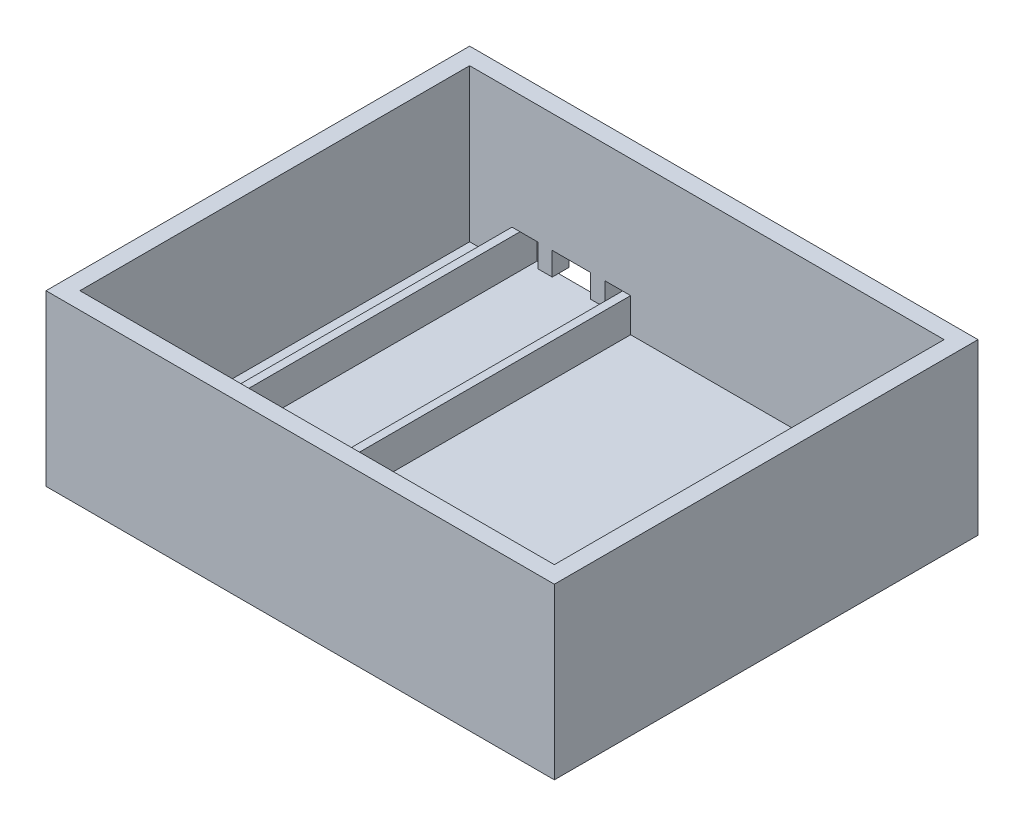
ISO-10303-21;
HEADER;
FILE_DESCRIPTION(('STEP AP214'),'2;1');
FILE_NAME('part.step','',(''),(''),'','','');
FILE_SCHEMA(('AUTOMOTIVE_DESIGN { 1 0 10303 214 1 1 1 1 }'));
ENDSEC;
DATA;
#1=APPLICATION_CONTEXT('core data for automotive mechanical design processes');
#2=APPLICATION_PROTOCOL_DEFINITION('international standard','automotive_design',2000,#1);
#3=PRODUCT_CONTEXT('',#1,'mechanical');
#4=PRODUCT('Part','Part','',(#3));
#5=PRODUCT_RELATED_PRODUCT_CATEGORY('part','',(#4));
#6=PRODUCT_DEFINITION_FORMATION('','',#4);
#7=PRODUCT_DEFINITION_CONTEXT('part definition',#1,'design');
#8=PRODUCT_DEFINITION('design','',#6,#7);
#9=PRODUCT_DEFINITION_SHAPE('','',#8);
#10=(LENGTH_UNIT() NAMED_UNIT(*) SI_UNIT(.MILLI.,.METRE.));
#11=(NAMED_UNIT(*) PLANE_ANGLE_UNIT() SI_UNIT($,.RADIAN.));
#12=(NAMED_UNIT(*) SI_UNIT($,.STERADIAN.) SOLID_ANGLE_UNIT());
#13=UNCERTAINTY_MEASURE_WITH_UNIT(LENGTH_MEASURE(1.E-05),#10,'distance_accuracy_value','');
#14=(GEOMETRIC_REPRESENTATION_CONTEXT(3) GLOBAL_UNCERTAINTY_ASSIGNED_CONTEXT((#13)) GLOBAL_UNIT_ASSIGNED_CONTEXT((#10,
#11,#12)) REPRESENTATION_CONTEXT('',''));
#15=CARTESIAN_POINT('',(0.,0.,0.));
#16=DIRECTION('',(0.,0.,1.));
#17=DIRECTION('',(1.,0.,0.));
#18=AXIS2_PLACEMENT_3D('',#15,#16,#17);
#19=CARTESIAN_POINT('',(0.,12.,0.));
#20=DIRECTION('',(0.,1.,0.));
#21=DIRECTION('',(0.,0.,1.));
#22=AXIS2_PLACEMENT_3D('',#19,#20,#21);
#23=PLANE('',#22);
#24=DIRECTION('',(0.,0.,1.));
#25=VECTOR('',#24,1.);
#26=CARTESIAN_POINT('',(-54.6743041305773,12.,-56.0826927806848));
#27=LINE('',#26,#25);
#28=CARTESIAN_POINT('',(-54.6743041305773,12.,-56.0826927806848));
#29=VERTEX_POINT('',#28);
#30=CARTESIAN_POINT('',(-54.6743041305773,12.,9.91730721931521));
#31=VERTEX_POINT('',#30);
#32=EDGE_CURVE('E233',#29,#31,#27,.T.);
#33=ORIENTED_EDGE('',*,*,#32,.F.);
#34=DIRECTION('',(1.,0.,0.));
#35=VECTOR('',#34,1.);
#36=CARTESIAN_POINT('',(-66.5712229422652,12.,-56.0826927806848));
#37=LINE('',#36,#35);
#38=CARTESIAN_POINT('',(-56.5712229422651,12.,-56.0826927806848));
#39=VERTEX_POINT('',#38);
#40=EDGE_CURVE('E240',#39,#29,#37,.T.);
#41=ORIENTED_EDGE('',*,*,#40,.F.);
#42=DIRECTION('',(0.,0.,1.));
#43=VECTOR('',#42,1.);
#44=CARTESIAN_POINT('',(-56.5712229422651,12.,-60.0826927806848));
#45=LINE('',#44,#43);
#46=CARTESIAN_POINT('',(-56.5712229422652,12.,9.91730721931521));
#47=VERTEX_POINT('',#46);
#48=EDGE_CURVE('E314',#39,#47,#45,.T.);
#49=ORIENTED_EDGE('',*,*,#48,.T.);
#50=DIRECTION('',(1.,0.,0.));
#51=VECTOR('',#50,1.);
#52=CARTESIAN_POINT('',(-56.5712229422652,12.,9.91730721931521));
#53=LINE('',#52,#51);
#54=EDGE_CURVE('E318',#47,#31,#53,.T.);
#55=ORIENTED_EDGE('',*,*,#54,.T.);
#56=EDGE_LOOP('',(#33,#41,#49,#55));
#57=FACE_BOUND('',#56,.T.);
#58=ADVANCED_FACE('F35',(#57),#23,.T.);
#59=CARTESIAN_POINT('',(-56.5712229422652,12.,9.91730721931521));
#60=DIRECTION('',(0.,0.,-1.));
#61=DIRECTION('',(-1.,0.,0.));
#62=AXIS2_PLACEMENT_3D('',#59,#60,#61);
#63=PLANE('',#62);
#64=DIRECTION('',(1.,0.,0.));
#65=VECTOR('',#64,1.);
#66=CARTESIAN_POINT('',(-56.5712229422652,4.,9.91730721931521));
#67=LINE('',#66,#65);
#68=CARTESIAN_POINT('',(-56.5712229422652,4.,9.91730721931521));
#69=VERTEX_POINT('',#68);
#70=CARTESIAN_POINT('',(-54.6743041305773,4.,9.91730721931521));
#71=VERTEX_POINT('',#70);
#72=EDGE_CURVE('E323',#69,#71,#67,.T.);
#73=ORIENTED_EDGE('',*,*,#72,.T.);
#74=DIRECTION('',(0.,-1.,0.));
#75=VECTOR('',#74,1.);
#76=CARTESIAN_POINT('',(-54.6743041305773,12.,9.91730721931521));
#77=LINE('',#76,#75);
#78=EDGE_CURVE('E55',#31,#71,#77,.T.);
#79=ORIENTED_EDGE('',*,*,#78,.F.);
#80=ORIENTED_EDGE('',*,*,#54,.F.);
#81=DIRECTION('',(0.,-1.,0.));
#82=VECTOR('',#81,1.);
#83=CARTESIAN_POINT('',(-56.5712229422652,12.,9.91730721931521));
#84=LINE('',#83,#82);
#85=EDGE_CURVE('E329',#47,#69,#84,.T.);
#86=ORIENTED_EDGE('',*,*,#85,.T.);
#87=EDGE_LOOP('',(#73,#79,#80,#86));
#88=FACE_BOUND('',#87,.T.);
#89=ADVANCED_FACE('F429',(#88),#63,.F.);
#90=CARTESIAN_POINT('',(-66.5712229422652,4.,-56.0826927806848));
#91=DIRECTION('',(0.,0.,-1.));
#92=DIRECTION('',(-1.,0.,0.));
#93=AXIS2_PLACEMENT_3D('',#90,#91,#92);
#94=PLANE('',#93);
#95=ORIENTED_EDGE('',*,*,#40,.T.);
#96=DIRECTION('',(-1.,0.,0.));
#97=VECTOR('',#96,1.);
#98=CARTESIAN_POINT('',(-54.6743041305773,12.,-56.0826927806848));
#99=LINE('',#98,#97);
#100=CARTESIAN_POINT('',(-50.4743041305773,12.,-56.0826927806848));
#101=VERTEX_POINT('',#100);
#102=EDGE_CURVE('E213',#101,#29,#99,.T.);
#103=ORIENTED_EDGE('',*,*,#102,.F.);
#104=DIRECTION('',(0.,1.,0.));
#105=VECTOR('',#104,1.);
#106=CARTESIAN_POINT('',(-50.4743041305773,12.,-56.0826927806848));
#107=LINE('',#106,#105);
#108=CARTESIAN_POINT('',(-50.4743041305773,6.53,-56.0826927806848));
#109=VERTEX_POINT('',#108);
#110=EDGE_CURVE('E714',#109,#101,#107,.T.);
#111=ORIENTED_EDGE('',*,*,#110,.F.);
#112=DIRECTION('',(-1.,0.,0.));
#113=VECTOR('',#112,1.);
#114=CARTESIAN_POINT('',(-50.4743041305773,6.53,-56.0826927806848));
#115=LINE('',#114,#113);
#116=CARTESIAN_POINT('',(-47.0743041305773,6.53,-56.0826927806848));
#117=VERTEX_POINT('',#116);
#118=EDGE_CURVE('E290',#117,#109,#115,.T.);
#119=ORIENTED_EDGE('',*,*,#118,.F.);
#120=DIRECTION('',(0.,-1.,0.));
#121=VECTOR('',#120,1.);
#122=CARTESIAN_POINT('',(-47.0743041305773,6.53,-56.0826927806848));
#123=LINE('',#122,#121);
#124=CARTESIAN_POINT('',(-47.0743041305773,12.,-56.0826927806848));
#125=VERTEX_POINT('',#124);
#126=EDGE_CURVE('E717',#125,#117,#123,.T.);
#127=ORIENTED_EDGE('',*,*,#126,.F.);
#128=DIRECTION('',(-1.,0.,0.));
#129=VECTOR('',#128,1.);
#130=CARTESIAN_POINT('',(-47.0743041305773,12.,-56.0826927806848));
#131=LINE('',#130,#129);
#132=CARTESIAN_POINT('',(-38.0743041305773,12.,-56.0826927806848));
#133=VERTEX_POINT('',#132);
#134=EDGE_CURVE('E720',#133,#125,#131,.T.);
#135=ORIENTED_EDGE('',*,*,#134,.F.);
#136=DIRECTION('',(0.,1.,0.));
#137=VECTOR('',#136,1.);
#138=CARTESIAN_POINT('',(-38.0743041305773,6.53,-56.0826927806848));
#139=LINE('',#138,#137);
#140=CARTESIAN_POINT('',(-38.0743041305773,6.53,-56.0826927806848));
#141=VERTEX_POINT('',#140);
#142=EDGE_CURVE('E723',#141,#133,#139,.T.);
#143=ORIENTED_EDGE('',*,*,#142,.F.);
#144=DIRECTION('',(-1.,0.,0.));
#145=VECTOR('',#144,1.);
#146=CARTESIAN_POINT('',(-38.0743041305773,6.53,-56.0826927806848));
#147=LINE('',#146,#145);
#148=CARTESIAN_POINT('',(-34.6643041305773,6.53,-56.0826927806848));
#149=VERTEX_POINT('',#148);
#150=EDGE_CURVE('E726',#149,#141,#147,.T.);
#151=ORIENTED_EDGE('',*,*,#150,.F.);
#152=DIRECTION('',(0.,-1.,0.));
#153=VECTOR('',#152,1.);
#154=CARTESIAN_POINT('',(-34.6643041305773,12.,-56.0826927806848));
#155=LINE('',#154,#153);
#156=CARTESIAN_POINT('',(-34.6643041305773,12.,-56.0826927806848));
#157=VERTEX_POINT('',#156);
#158=EDGE_CURVE('E224',#157,#149,#155,.T.);
#159=ORIENTED_EDGE('',*,*,#158,.F.);
#160=DIRECTION('',(-1.,0.,0.));
#161=VECTOR('',#160,1.);
#162=CARTESIAN_POINT('',(-34.6643041305773,12.,-56.0826927806848));
#163=LINE('',#162,#161);
#164=CARTESIAN_POINT('',(-30.4643041305773,12.,-56.0826927806848));
#165=VERTEX_POINT('',#164);
#166=EDGE_CURVE('E204',#165,#157,#163,.T.);
#167=ORIENTED_EDGE('',*,*,#166,.F.);
#168=CARTESIAN_POINT('',(-28.5712229422651,12.,-56.0826927806848));
#169=VERTEX_POINT('',#168);
#170=EDGE_CURVE('E220',#165,#169,#37,.T.);
#171=ORIENTED_EDGE('',*,*,#170,.T.);
#172=DIRECTION('',(0.,1.,0.));
#173=VECTOR('',#172,1.);
#174=CARTESIAN_POINT('',(-28.5712229422651,4.,-56.0826927806848));
#175=LINE('',#174,#173);
#176=CARTESIAN_POINT('',(-28.5712229422651,4.,-56.0826927806848));
#177=VERTEX_POINT('',#176);
#178=EDGE_CURVE('E332',#177,#169,#175,.T.);
#179=ORIENTED_EDGE('',*,*,#178,.F.);
#180=DIRECTION('',(-1.,0.,0.));
#181=VECTOR('',#180,1.);
#182=CARTESIAN_POINT('',(-66.5712229422652,4.,-56.0826927806848));
#183=LINE('',#182,#181);
#184=CARTESIAN_POINT('',(45.4287770577348,4.,-56.0826927806848));
#185=VERTEX_POINT('',#184);
#186=EDGE_CURVE('E348',#185,#177,#183,.T.);
#187=ORIENTED_EDGE('',*,*,#186,.F.);
#188=DIRECTION('',(0.,1.,0.));
#189=VECTOR('',#188,1.);
#190=CARTESIAN_POINT('',(45.4287770577348,4.,-56.0826927806848));
#191=LINE('',#190,#189);
#192=CARTESIAN_POINT('',(45.4287770577348,40.,-56.0826927806848));
#193=VERTEX_POINT('',#192);
#194=EDGE_CURVE('E364',#185,#193,#191,.T.);
#195=ORIENTED_EDGE('',*,*,#194,.T.);
#196=DIRECTION('',(-1.,0.,0.));
#197=VECTOR('',#196,1.);
#198=CARTESIAN_POINT('',(-66.5712229422652,40.,-56.0826927806848));
#199=LINE('',#198,#197);
#200=CARTESIAN_POINT('',(-66.5712229422652,40.,-56.0826927806848));
#201=VERTEX_POINT('',#200);
#202=EDGE_CURVE('E341',#193,#201,#199,.T.);
#203=ORIENTED_EDGE('',*,*,#202,.T.);
#204=DIRECTION('',(0.,1.,0.));
#205=VECTOR('',#204,1.);
#206=CARTESIAN_POINT('',(-66.5712229422652,4.,-56.0826927806848));
#207=LINE('',#206,#205);
#208=CARTESIAN_POINT('',(-66.5712229422652,4.,-56.0826927806848));
#209=VERTEX_POINT('',#208);
#210=EDGE_CURVE('E361',#209,#201,#207,.T.);
#211=ORIENTED_EDGE('',*,*,#210,.F.);
#212=CARTESIAN_POINT('',(-56.5712229422651,4.,-56.0826927806848));
#213=VERTEX_POINT('',#212);
#214=EDGE_CURVE('E347',#213,#209,#183,.T.);
#215=ORIENTED_EDGE('',*,*,#214,.F.);
#216=DIRECTION('',(0.,-1.,0.));
#217=VECTOR('',#216,1.);
#218=CARTESIAN_POINT('',(-56.5712229422651,4.,-56.0826927806848));
#219=LINE('',#218,#217);
#220=EDGE_CURVE('E334',#39,#213,#219,.T.);
#221=ORIENTED_EDGE('',*,*,#220,.F.);
#222=EDGE_LOOP('',(#95,#103,#111,#119,#127,#135,#143,#151,#159,#167,#171,#179,#187,#195,#203,
#211,#215,#221));
#223=FACE_BOUND('',#222,.T.);
#224=ADVANCED_FACE('F217',(#223),#94,.F.);
#225=CARTESIAN_POINT('',(0.,4.,0.));
#226=DIRECTION('',(0.,1.,0.));
#227=DIRECTION('',(0.,0.,1.));
#228=AXIS2_PLACEMENT_3D('',#225,#226,#227);
#229=PLANE('',#228);
#230=ORIENTED_EDGE('',*,*,#72,.F.);
#231=DIRECTION('',(0.,0.,-1.));
#232=VECTOR('',#231,1.);
#233=CARTESIAN_POINT('',(-56.5712229422652,4.,0.));
#234=LINE('',#233,#232);
#235=EDGE_CURVE('E241',#69,#213,#234,.T.);
#236=ORIENTED_EDGE('',*,*,#235,.T.);
#237=ORIENTED_EDGE('',*,*,#214,.T.);
#238=DIRECTION('',(0.,0.,1.));
#239=VECTOR('',#238,1.);
#240=CARTESIAN_POINT('',(-66.5712229422652,4.,-56.0826927806848));
#241=LINE('',#240,#239);
#242=CARTESIAN_POINT('',(-66.5712229422651,4.,35.9173072193152));
#243=VERTEX_POINT('',#242);
#244=EDGE_CURVE('E337',#209,#243,#241,.T.);
#245=ORIENTED_EDGE('',*,*,#244,.T.);
#246=DIRECTION('',(1.,0.,0.));
#247=VECTOR('',#246,1.);
#248=CARTESIAN_POINT('',(-66.5712229422651,4.,35.9173072193152));
#249=LINE('',#248,#247);
#250=CARTESIAN_POINT('',(45.4287770577348,4.,35.9173072193152));
#251=VERTEX_POINT('',#250);
#252=EDGE_CURVE('E340',#243,#251,#249,.T.);
#253=ORIENTED_EDGE('',*,*,#252,.T.);
#254=DIRECTION('',(0.,0.,-1.));
#255=VECTOR('',#254,1.);
#256=CARTESIAN_POINT('',(45.4287770577348,4.,-56.0826927806848));
#257=LINE('',#256,#255);
#258=EDGE_CURVE('E344',#251,#185,#257,.T.);
#259=ORIENTED_EDGE('',*,*,#258,.T.);
#260=ORIENTED_EDGE('',*,*,#186,.T.);
#261=DIRECTION('',(0.,0.,-1.));
#262=VECTOR('',#261,1.);
#263=CARTESIAN_POINT('',(-28.5712229422651,4.,-60.0826927806848));
#264=LINE('',#263,#262);
#265=CARTESIAN_POINT('',(-28.5712229422651,4.,9.91730721931521));
#266=VERTEX_POINT('',#265);
#267=EDGE_CURVE('E317',#266,#177,#264,.T.);
#268=ORIENTED_EDGE('',*,*,#267,.F.);
#269=CARTESIAN_POINT('',(-30.4643041305773,4.,9.91730721931521));
#270=VERTEX_POINT('',#269);
#271=EDGE_CURVE('E310',#270,#266,#67,.T.);
#272=ORIENTED_EDGE('',*,*,#271,.F.);
#273=DIRECTION('',(0.,0.,1.));
#274=VECTOR('',#273,1.);
#275=CARTESIAN_POINT('',(-30.4643041305773,4.,-56.0826927806848));
#276=LINE('',#275,#274);
#277=CARTESIAN_POINT('',(-30.4643041305773,4.,-60.0826927806848));
#278=VERTEX_POINT('',#277);
#279=EDGE_CURVE('E234',#278,#270,#276,.T.);
#280=ORIENTED_EDGE('',*,*,#279,.F.);
#281=DIRECTION('',(1.,0.,0.));
#282=VECTOR('',#281,1.);
#283=CARTESIAN_POINT('',(-70.5712229422652,4.,-60.0826927806848));
#284=LINE('',#283,#282);
#285=CARTESIAN_POINT('',(-54.6743041305773,4.,-60.0826927806848));
#286=VERTEX_POINT('',#285);
#287=EDGE_CURVE('E251',#286,#278,#284,.T.);
#288=ORIENTED_EDGE('',*,*,#287,.F.);
#289=DIRECTION('',(0.,0.,1.));
#290=VECTOR('',#289,1.);
#291=CARTESIAN_POINT('',(-54.6743041305773,4.,-56.0826927806848));
#292=LINE('',#291,#290);
#293=EDGE_CURVE('E50',#286,#71,#292,.T.);
#294=ORIENTED_EDGE('',*,*,#293,.T.);
#295=EDGE_LOOP('',(#230,#236,#237,#245,#253,#259,#260,#268,#272,#280,#288,#294));
#296=FACE_BOUND('',#295,.T.);
#297=ADVANCED_FACE('F478',(#296),#229,.T.);
#298=CARTESIAN_POINT('',(-70.5712229422652,40.,39.9173072193152));
#299=DIRECTION('',(1.,0.,0.));
#300=DIRECTION('',(0.,0.,-1.));
#301=AXIS2_PLACEMENT_3D('',#298,#299,#300);
#302=PLANE('',#301);
#303=DIRECTION('',(0.,0.,1.));
#304=VECTOR('',#303,1.);
#305=CARTESIAN_POINT('',(-70.5712229422652,0.,39.9173072193152));
#306=LINE('',#305,#304);
#307=CARTESIAN_POINT('',(-70.5712229422652,0.,-60.0826927806848));
#308=VERTEX_POINT('',#307);
#309=CARTESIAN_POINT('',(-70.5712229422652,0.,39.9173072193152));
#310=VERTEX_POINT('',#309);
#311=EDGE_CURVE('E363',#308,#310,#306,.T.);
#312=ORIENTED_EDGE('',*,*,#311,.T.);
#313=DIRECTION('',(0.,-1.,0.));
#314=VECTOR('',#313,1.);
#315=CARTESIAN_POINT('',(-70.5712229422652,40.,39.9173072193152));
#316=LINE('',#315,#314);
#317=CARTESIAN_POINT('',(-70.5712229422652,40.,39.9173072193152));
#318=VERTEX_POINT('',#317);
#319=EDGE_CURVE('E245',#318,#310,#316,.T.);
#320=ORIENTED_EDGE('',*,*,#319,.F.);
#321=DIRECTION('',(0.,0.,1.));
#322=VECTOR('',#321,1.);
#323=CARTESIAN_POINT('',(-70.5712229422652,40.,39.9173072193152));
#324=LINE('',#323,#322);
#325=CARTESIAN_POINT('',(-70.5712229422652,40.,-60.0826927806848));
#326=VERTEX_POINT('',#325);
#327=EDGE_CURVE('E370',#326,#318,#324,.T.);
#328=ORIENTED_EDGE('',*,*,#327,.F.);
#329=DIRECTION('',(0.,-1.,0.));
#330=VECTOR('',#329,1.);
#331=CARTESIAN_POINT('',(-70.5712229422652,40.,-60.0826927806848));
#332=LINE('',#331,#330);
#333=EDGE_CURVE('E380',#326,#308,#332,.T.);
#334=ORIENTED_EDGE('',*,*,#333,.T.);
#335=EDGE_LOOP('',(#312,#320,#328,#334));
#336=FACE_BOUND('',#335,.T.);
#337=ADVANCED_FACE('F37',(#336),#302,.F.);
#338=CARTESIAN_POINT('',(-70.5712229422652,40.,39.9173072193152));
#339=DIRECTION('',(0.,0.,-1.));
#340=DIRECTION('',(-1.,0.,0.));
#341=AXIS2_PLACEMENT_3D('',#338,#339,#340);
#342=PLANE('',#341);
#343=DIRECTION('',(1.,0.,0.));
#344=VECTOR('',#343,1.);
#345=CARTESIAN_POINT('',(-70.5712229422652,0.,39.9173072193152));
#346=LINE('',#345,#344);
#347=CARTESIAN_POINT('',(49.4287770577348,0.,39.9173072193152));
#348=VERTEX_POINT('',#347);
#349=EDGE_CURVE('E383',#310,#348,#346,.T.);
#350=ORIENTED_EDGE('',*,*,#349,.T.);
#351=DIRECTION('',(0.,-1.,0.));
#352=VECTOR('',#351,1.);
#353=CARTESIAN_POINT('',(49.4287770577348,40.,39.9173072193152));
#354=LINE('',#353,#352);
#355=CARTESIAN_POINT('',(49.4287770577348,40.,39.9173072193152));
#356=VERTEX_POINT('',#355);
#357=EDGE_CURVE('E393',#356,#348,#354,.T.);
#358=ORIENTED_EDGE('',*,*,#357,.F.);
#359=DIRECTION('',(1.,0.,0.));
#360=VECTOR('',#359,1.);
#361=CARTESIAN_POINT('',(-70.5712229422652,40.,39.9173072193152));
#362=LINE('',#361,#360);
#363=EDGE_CURVE('E373',#318,#356,#362,.T.);
#364=ORIENTED_EDGE('',*,*,#363,.F.);
#365=ORIENTED_EDGE('',*,*,#319,.T.);
#366=EDGE_LOOP('',(#350,#358,#364,#365));
#367=FACE_BOUND('',#366,.T.);
#368=ADVANCED_FACE('F398',(#367),#342,.F.);
#369=CARTESIAN_POINT('',(49.4287770577348,40.,39.9173072193152));
#370=DIRECTION('',(-1.,0.,0.));
#371=DIRECTION('',(0.,0.,1.));
#372=AXIS2_PLACEMENT_3D('',#369,#370,#371);
#373=PLANE('',#372);
#374=DIRECTION('',(0.,0.,-1.));
#375=VECTOR('',#374,1.);
#376=CARTESIAN_POINT('',(49.4287770577348,0.,39.9173072193152));
#377=LINE('',#376,#375);
#378=CARTESIAN_POINT('',(49.4287770577348,0.,-60.0826927806848));
#379=VERTEX_POINT('',#378);
#380=EDGE_CURVE('E385',#348,#379,#377,.T.);
#381=ORIENTED_EDGE('',*,*,#380,.T.);
#382=DIRECTION('',(0.,-1.,0.));
#383=VECTOR('',#382,1.);
#384=CARTESIAN_POINT('',(49.4287770577348,40.,-60.0826927806848));
#385=LINE('',#384,#383);
#386=CARTESIAN_POINT('',(49.4287770577348,40.,-60.0826927806848));
#387=VERTEX_POINT('',#386);
#388=EDGE_CURVE('E390',#387,#379,#385,.T.);
#389=ORIENTED_EDGE('',*,*,#388,.F.);
#390=DIRECTION('',(0.,0.,-1.));
#391=VECTOR('',#390,1.);
#392=CARTESIAN_POINT('',(49.4287770577348,40.,39.9173072193152));
#393=LINE('',#392,#391);
#394=EDGE_CURVE('E376',#356,#387,#393,.T.);
#395=ORIENTED_EDGE('',*,*,#394,.F.);
#396=ORIENTED_EDGE('',*,*,#357,.T.);
#397=EDGE_LOOP('',(#381,#389,#395,#396));
#398=FACE_BOUND('',#397,.T.);
#399=ADVANCED_FACE('F410',(#398),#373,.F.);
#400=CARTESIAN_POINT('',(-70.5712229422652,40.,-60.0826927806848));
#401=DIRECTION('',(0.,0.,1.));
#402=DIRECTION('',(1.,0.,0.));
#403=AXIS2_PLACEMENT_3D('',#400,#401,#402);
#404=PLANE('',#403);
#405=DIRECTION('',(0.,1.,0.));
#406=VECTOR('',#405,1.);
#407=CARTESIAN_POINT('',(-50.4743041305773,40.,-60.0826927806848));
#408=LINE('',#407,#406);
#409=CARTESIAN_POINT('',(-50.4743041305773,6.53,-60.0826927806848));
#410=VERTEX_POINT('',#409);
#411=CARTESIAN_POINT('',(-50.4743041305773,12.,-60.0826927806848));
#412=VERTEX_POINT('',#411);
#413=EDGE_CURVE('E43',#410,#412,#408,.T.);
#414=ORIENTED_EDGE('',*,*,#413,.T.);
#415=DIRECTION('',(-1.,0.,0.));
#416=VECTOR('',#415,1.);
#417=CARTESIAN_POINT('',(-70.5712229422652,12.,-60.0826927806848));
#418=LINE('',#417,#416);
#419=CARTESIAN_POINT('',(-54.6743041305773,12.,-60.0826927806848));
#420=VERTEX_POINT('',#419);
#421=EDGE_CURVE('E11',#412,#420,#418,.T.);
#422=ORIENTED_EDGE('',*,*,#421,.T.);
#423=DIRECTION('',(0.,-1.,0.));
#424=VECTOR('',#423,1.);
#425=CARTESIAN_POINT('',(-54.6743041305773,40.,-60.0826927806848));
#426=LINE('',#425,#424);
#427=EDGE_CURVE('E243',#420,#286,#426,.T.);
#428=ORIENTED_EDGE('',*,*,#427,.T.);
#429=ORIENTED_EDGE('',*,*,#287,.T.);
#430=DIRECTION('',(0.,1.,0.));
#431=VECTOR('',#430,1.);
#432=CARTESIAN_POINT('',(-30.4643041305773,40.,-60.0826927806848));
#433=LINE('',#432,#431);
#434=CARTESIAN_POINT('',(-30.4643041305773,12.,-60.0826927806848));
#435=VERTEX_POINT('',#434);
#436=EDGE_CURVE('E254',#278,#435,#433,.T.);
#437=ORIENTED_EDGE('',*,*,#436,.T.);
#438=DIRECTION('',(-1.,0.,0.));
#439=VECTOR('',#438,1.);
#440=CARTESIAN_POINT('',(-70.5712229422652,12.,-60.0826927806848));
#441=LINE('',#440,#439);
#442=CARTESIAN_POINT('',(-34.6643041305773,12.,-60.0826927806848));
#443=VERTEX_POINT('',#442);
#444=EDGE_CURVE('E207',#435,#443,#441,.T.);
#445=ORIENTED_EDGE('',*,*,#444,.T.);
#446=DIRECTION('',(0.,-1.,0.));
#447=VECTOR('',#446,1.);
#448=CARTESIAN_POINT('',(-34.6643041305773,40.,-60.0826927806848));
#449=LINE('',#448,#447);
#450=CARTESIAN_POINT('',(-34.6643041305773,6.53,-60.0826927806848));
#451=VERTEX_POINT('',#450);
#452=EDGE_CURVE('E257',#443,#451,#449,.T.);
#453=ORIENTED_EDGE('',*,*,#452,.T.);
#454=DIRECTION('',(-1.,0.,0.));
#455=VECTOR('',#454,1.);
#456=CARTESIAN_POINT('',(-70.5712229422652,6.53,-60.0826927806848));
#457=LINE('',#456,#455);
#458=CARTESIAN_POINT('',(-38.0743041305773,6.53,-60.0826927806848));
#459=VERTEX_POINT('',#458);
#460=EDGE_CURVE('E260',#451,#459,#457,.T.);
#461=ORIENTED_EDGE('',*,*,#460,.T.);
#462=DIRECTION('',(0.,1.,0.));
#463=VECTOR('',#462,1.);
#464=CARTESIAN_POINT('',(-38.0743041305773,40.,-60.0826927806848));
#465=LINE('',#464,#463);
#466=CARTESIAN_POINT('',(-38.0743041305773,12.,-60.0826927806848));
#467=VERTEX_POINT('',#466);
#468=EDGE_CURVE('E263',#459,#467,#465,.T.);
#469=ORIENTED_EDGE('',*,*,#468,.T.);
#470=DIRECTION('',(-1.,0.,0.));
#471=VECTOR('',#470,1.);
#472=CARTESIAN_POINT('',(-70.5712229422652,12.,-60.0826927806848));
#473=LINE('',#472,#471);
#474=CARTESIAN_POINT('',(-47.0743041305773,12.,-60.0826927806848));
#475=VERTEX_POINT('',#474);
#476=EDGE_CURVE('E266',#467,#475,#473,.T.);
#477=ORIENTED_EDGE('',*,*,#476,.T.);
#478=DIRECTION('',(0.,-1.,0.));
#479=VECTOR('',#478,1.);
#480=CARTESIAN_POINT('',(-47.0743041305773,40.,-60.0826927806848));
#481=LINE('',#480,#479);
#482=CARTESIAN_POINT('',(-47.0743041305773,6.53,-60.0826927806848));
#483=VERTEX_POINT('',#482);
#484=EDGE_CURVE('E269',#475,#483,#481,.T.);
#485=ORIENTED_EDGE('',*,*,#484,.T.);
#486=DIRECTION('',(-1.,0.,0.));
#487=VECTOR('',#486,1.);
#488=CARTESIAN_POINT('',(-70.5712229422652,6.53,-60.0826927806848));
#489=LINE('',#488,#487);
#490=EDGE_CURVE('E272',#483,#410,#489,.T.);
#491=ORIENTED_EDGE('',*,*,#490,.T.);
#492=EDGE_LOOP('',(#414,#422,#428,#429,#437,#445,#453,#461,#469,#477,#485,#491));
#493=FACE_BOUND('',#492,.T.);
#494=DIRECTION('',(-1.,0.,0.));
#495=VECTOR('',#494,1.);
#496=CARTESIAN_POINT('',(-70.5712229422652,0.,-60.0826927806848));
#497=LINE('',#496,#495);
#498=EDGE_CURVE('E374',#379,#308,#497,.T.);
#499=ORIENTED_EDGE('',*,*,#498,.T.);
#500=ORIENTED_EDGE('',*,*,#333,.F.);
#501=DIRECTION('',(-1.,0.,0.));
#502=VECTOR('',#501,1.);
#503=CARTESIAN_POINT('',(-70.5712229422652,40.,-60.0826927806848));
#504=LINE('',#503,#502);
#505=EDGE_CURVE('E378',#387,#326,#504,.T.);
#506=ORIENTED_EDGE('',*,*,#505,.F.);
#507=ORIENTED_EDGE('',*,*,#388,.T.);
#508=EDGE_LOOP('',(#499,#500,#506,#507));
#509=FACE_BOUND('',#508,.T.);
#510=ADVANCED_FACE('F276',(#493,#509),#404,.F.);
#511=CARTESIAN_POINT('',(0.,40.,0.));
#512=DIRECTION('',(0.,-1.,0.));
#513=DIRECTION('',(0.,0.,-1.));
#514=AXIS2_PLACEMENT_3D('',#511,#512,#513);
#515=PLANE('',#514);
#516=DIRECTION('',(1.,0.,0.));
#517=VECTOR('',#516,1.);
#518=CARTESIAN_POINT('',(-66.5712229422651,40.,35.9173072193152));
#519=LINE('',#518,#517);
#520=CARTESIAN_POINT('',(-66.5712229422651,40.,35.9173072193152));
#521=VERTEX_POINT('',#520);
#522=CARTESIAN_POINT('',(45.4287770577348,40.,35.9173072193152));
#523=VERTEX_POINT('',#522);
#524=EDGE_CURVE('E353',#521,#523,#519,.T.);
#525=ORIENTED_EDGE('',*,*,#524,.F.);
#526=DIRECTION('',(0.,0.,1.));
#527=VECTOR('',#526,1.);
#528=CARTESIAN_POINT('',(-66.5712229422652,40.,-56.0826927806848));
#529=LINE('',#528,#527);
#530=EDGE_CURVE('E336',#201,#521,#529,.T.);
#531=ORIENTED_EDGE('',*,*,#530,.F.);
#532=ORIENTED_EDGE('',*,*,#202,.F.);
#533=DIRECTION('',(0.,0.,-1.));
#534=VECTOR('',#533,1.);
#535=CARTESIAN_POINT('',(45.4287770577348,40.,-56.0826927806848));
#536=LINE('',#535,#534);
#537=EDGE_CURVE('E356',#523,#193,#536,.T.);
#538=ORIENTED_EDGE('',*,*,#537,.F.);
#539=EDGE_LOOP('',(#525,#531,#532,#538));
#540=FACE_BOUND('',#539,.T.);
#541=ORIENTED_EDGE('',*,*,#327,.T.);
#542=ORIENTED_EDGE('',*,*,#363,.T.);
#543=ORIENTED_EDGE('',*,*,#394,.T.);
#544=ORIENTED_EDGE('',*,*,#505,.T.);
#545=EDGE_LOOP('',(#541,#542,#543,#544));
#546=FACE_BOUND('',#545,.T.);
#547=ADVANCED_FACE('F414',(#540,#546),#515,.F.);
#548=CARTESIAN_POINT('',(0.,0.,0.));
#549=DIRECTION('',(0.,-1.,0.));
#550=DIRECTION('',(0.,0.,-1.));
#551=AXIS2_PLACEMENT_3D('',#548,#549,#550);
#552=PLANE('',#551);
#553=ORIENTED_EDGE('',*,*,#311,.F.);
#554=ORIENTED_EDGE('',*,*,#498,.F.);
#555=ORIENTED_EDGE('',*,*,#380,.F.);
#556=ORIENTED_EDGE('',*,*,#349,.F.);
#557=EDGE_LOOP('',(#553,#554,#555,#556));
#558=FACE_BOUND('',#557,.T.);
#559=ADVANCED_FACE('F406',(#558),#552,.T.);
#560=CARTESIAN_POINT('',(-66.5712229422652,4.,-56.0826927806848));
#561=DIRECTION('',(-1.,0.,0.));
#562=DIRECTION('',(0.,0.,1.));
#563=AXIS2_PLACEMENT_3D('',#560,#561,#562);
#564=PLANE('',#563);
#565=ORIENTED_EDGE('',*,*,#530,.T.);
#566=DIRECTION('',(0.,1.,0.));
#567=VECTOR('',#566,1.);
#568=CARTESIAN_POINT('',(-66.5712229422651,4.,35.9173072193152));
#569=LINE('',#568,#567);
#570=EDGE_CURVE('E351',#243,#521,#569,.T.);
#571=ORIENTED_EDGE('',*,*,#570,.F.);
#572=ORIENTED_EDGE('',*,*,#244,.F.);
#573=ORIENTED_EDGE('',*,*,#210,.T.);
#574=EDGE_LOOP('',(#565,#571,#572,#573));
#575=FACE_BOUND('',#574,.T.);
#576=ADVANCED_FACE('F422',(#575),#564,.F.);
#577=CARTESIAN_POINT('',(45.4287770577348,4.,-56.0826927806848));
#578=DIRECTION('',(1.,0.,0.));
#579=DIRECTION('',(0.,0.,-1.));
#580=AXIS2_PLACEMENT_3D('',#577,#578,#579);
#581=PLANE('',#580);
#582=ORIENTED_EDGE('',*,*,#537,.T.);
#583=ORIENTED_EDGE('',*,*,#194,.F.);
#584=ORIENTED_EDGE('',*,*,#258,.F.);
#585=DIRECTION('',(0.,1.,0.));
#586=VECTOR('',#585,1.);
#587=CARTESIAN_POINT('',(45.4287770577348,4.,35.9173072193152));
#588=LINE('',#587,#586);
#589=EDGE_CURVE('E366',#251,#523,#588,.T.);
#590=ORIENTED_EDGE('',*,*,#589,.T.);
#591=EDGE_LOOP('',(#582,#583,#584,#590));
#592=FACE_BOUND('',#591,.T.);
#593=ADVANCED_FACE('F455',(#592),#581,.F.);
#594=CARTESIAN_POINT('',(-66.5712229422651,4.,35.9173072193152));
#595=DIRECTION('',(0.,0.,1.));
#596=DIRECTION('',(1.,0.,0.));
#597=AXIS2_PLACEMENT_3D('',#594,#595,#596);
#598=PLANE('',#597);
#599=ORIENTED_EDGE('',*,*,#524,.T.);
#600=ORIENTED_EDGE('',*,*,#589,.F.);
#601=ORIENTED_EDGE('',*,*,#252,.F.);
#602=ORIENTED_EDGE('',*,*,#570,.T.);
#603=EDGE_LOOP('',(#599,#600,#601,#602));
#604=FACE_BOUND('',#603,.T.);
#605=ADVANCED_FACE('F445',(#604),#598,.F.);
#606=DIRECTION('',(0.,0.,1.));
#607=VECTOR('',#606,1.);
#608=CARTESIAN_POINT('',(-30.4643041305773,12.,-56.0826927806848));
#609=LINE('',#608,#607);
#610=CARTESIAN_POINT('',(-30.4643041305773,12.,9.91730721931521));
#611=VERTEX_POINT('',#610);
#612=EDGE_CURVE('E227',#165,#611,#609,.T.);
#613=ORIENTED_EDGE('',*,*,#612,.T.);
#614=CARTESIAN_POINT('',(-28.5712229422651,12.,9.91730721931521));
#615=VERTEX_POINT('',#614);
#616=EDGE_CURVE('E316',#611,#615,#53,.T.);
#617=ORIENTED_EDGE('',*,*,#616,.T.);
#618=DIRECTION('',(0.,0.,-1.));
#619=VECTOR('',#618,1.);
#620=CARTESIAN_POINT('',(-28.5712229422651,12.,-60.0826927806848));
#621=LINE('',#620,#619);
#622=EDGE_CURVE('E239',#615,#169,#621,.T.);
#623=ORIENTED_EDGE('',*,*,#622,.T.);
#624=ORIENTED_EDGE('',*,*,#170,.F.);
#625=EDGE_LOOP('',(#613,#617,#623,#624));
#626=FACE_BOUND('',#625,.T.);
#627=ADVANCED_FACE('F237',(#626),#23,.T.);
#628=CARTESIAN_POINT('',(-56.5712229422651,12.,-60.0826927806848));
#629=DIRECTION('',(1.,0.,0.));
#630=DIRECTION('',(0.,0.,-1.));
#631=AXIS2_PLACEMENT_3D('',#628,#629,#630);
#632=PLANE('',#631);
#633=ORIENTED_EDGE('',*,*,#48,.F.);
#634=ORIENTED_EDGE('',*,*,#220,.T.);
#635=ORIENTED_EDGE('',*,*,#235,.F.);
#636=ORIENTED_EDGE('',*,*,#85,.F.);
#637=EDGE_LOOP('',(#633,#634,#635,#636));
#638=FACE_BOUND('',#637,.T.);
#639=ADVANCED_FACE('F444',(#638),#632,.F.);
#640=CARTESIAN_POINT('',(-28.5712229422651,12.,-60.0826927806848));
#641=DIRECTION('',(-1.,0.,0.));
#642=DIRECTION('',(0.,0.,1.));
#643=AXIS2_PLACEMENT_3D('',#640,#641,#642);
#644=PLANE('',#643);
#645=ORIENTED_EDGE('',*,*,#267,.T.);
#646=ORIENTED_EDGE('',*,*,#178,.T.);
#647=ORIENTED_EDGE('',*,*,#622,.F.);
#648=DIRECTION('',(0.,-1.,0.));
#649=VECTOR('',#648,1.);
#650=CARTESIAN_POINT('',(-28.5712229422651,12.,9.91730721931521));
#651=LINE('',#650,#649);
#652=EDGE_CURVE('E322',#615,#266,#651,.T.);
#653=ORIENTED_EDGE('',*,*,#652,.T.);
#654=EDGE_LOOP('',(#645,#646,#647,#653));
#655=FACE_BOUND('',#654,.T.);
#656=ADVANCED_FACE('F451',(#655),#644,.F.);
#657=ORIENTED_EDGE('',*,*,#616,.F.);
#658=DIRECTION('',(0.,1.,0.));
#659=VECTOR('',#658,1.);
#660=CARTESIAN_POINT('',(-30.4643041305773,12.,9.91730721931521));
#661=LINE('',#660,#659);
#662=EDGE_CURVE('E230',#270,#611,#661,.T.);
#663=ORIENTED_EDGE('',*,*,#662,.F.);
#664=ORIENTED_EDGE('',*,*,#271,.T.);
#665=ORIENTED_EDGE('',*,*,#652,.F.);
#666=EDGE_LOOP('',(#657,#663,#664,#665));
#667=FACE_BOUND('',#666,.T.);
#668=ADVANCED_FACE('F439',(#667),#63,.F.);
#669=CARTESIAN_POINT('',(-54.6743041305773,12.,-56.0826927806848));
#670=DIRECTION('',(-1.,0.,0.));
#671=DIRECTION('',(0.,0.,1.));
#672=AXIS2_PLACEMENT_3D('',#669,#670,#671);
#673=PLANE('',#672);
#674=ORIENTED_EDGE('',*,*,#78,.T.);
#675=ORIENTED_EDGE('',*,*,#293,.F.);
#676=ORIENTED_EDGE('',*,*,#427,.F.);
#677=DIRECTION('',(0.,0.,1.));
#678=VECTOR('',#677,1.);
#679=CARTESIAN_POINT('',(-54.6743041305773,12.,-122.082692780685));
#680=LINE('',#679,#678);
#681=EDGE_CURVE('E294',#420,#29,#680,.T.);
#682=ORIENTED_EDGE('',*,*,#681,.T.);
#683=ORIENTED_EDGE('',*,*,#32,.T.);
#684=EDGE_LOOP('',(#674,#675,#676,#682,#683));
#685=FACE_BOUND('',#684,.T.);
#686=ADVANCED_FACE('F487',(#685),#673,.F.);
#687=CARTESIAN_POINT('',(-30.4643041305773,12.,-56.0826927806848));
#688=DIRECTION('',(1.,0.,0.));
#689=DIRECTION('',(0.,0.,-1.));
#690=AXIS2_PLACEMENT_3D('',#687,#688,#689);
#691=PLANE('',#690);
#692=ORIENTED_EDGE('',*,*,#662,.T.);
#693=ORIENTED_EDGE('',*,*,#612,.F.);
#694=DIRECTION('',(0.,0.,1.));
#695=VECTOR('',#694,1.);
#696=CARTESIAN_POINT('',(-30.4643041305773,12.,-122.082692780685));
#697=LINE('',#696,#695);
#698=EDGE_CURVE('E200',#435,#165,#697,.T.);
#699=ORIENTED_EDGE('',*,*,#698,.F.);
#700=ORIENTED_EDGE('',*,*,#436,.F.);
#701=ORIENTED_EDGE('',*,*,#279,.T.);
#702=EDGE_LOOP('',(#692,#693,#699,#700,#701));
#703=FACE_BOUND('',#702,.T.);
#704=ADVANCED_FACE('F228',(#703),#691,.F.);
#705=CARTESIAN_POINT('',(-54.6743041305773,12.,-122.082692780685));
#706=DIRECTION('',(0.,1.,0.));
#707=DIRECTION('',(0.,0.,1.));
#708=AXIS2_PLACEMENT_3D('',#705,#706,#707);
#709=PLANE('',#708);
#710=DIRECTION('',(0.,0.,1.));
#711=VECTOR('',#710,1.);
#712=CARTESIAN_POINT('',(-50.4743041305773,12.,-122.082692780685));
#713=LINE('',#712,#711);
#714=EDGE_CURVE('E285',#412,#101,#713,.T.);
#715=ORIENTED_EDGE('',*,*,#714,.T.);
#716=ORIENTED_EDGE('',*,*,#102,.T.);
#717=ORIENTED_EDGE('',*,*,#681,.F.);
#718=ORIENTED_EDGE('',*,*,#421,.F.);
#719=EDGE_LOOP('',(#715,#716,#717,#718));
#720=FACE_BOUND('',#719,.T.);
#721=ADVANCED_FACE('F611',(#720),#709,.F.);
#722=CARTESIAN_POINT('',(-50.4743041305773,12.,-122.082692780685));
#723=DIRECTION('',(1.,0.,0.));
#724=DIRECTION('',(0.,0.,-1.));
#725=AXIS2_PLACEMENT_3D('',#722,#723,#724);
#726=PLANE('',#725);
#727=DIRECTION('',(0.,0.,1.));
#728=VECTOR('',#727,1.);
#729=CARTESIAN_POINT('',(-50.4743041305773,6.53,-122.082692780685));
#730=LINE('',#729,#728);
#731=EDGE_CURVE('E283',#410,#109,#730,.T.);
#732=ORIENTED_EDGE('',*,*,#731,.T.);
#733=ORIENTED_EDGE('',*,*,#110,.T.);
#734=ORIENTED_EDGE('',*,*,#714,.F.);
#735=ORIENTED_EDGE('',*,*,#413,.F.);
#736=EDGE_LOOP('',(#732,#733,#734,#735));
#737=FACE_BOUND('',#736,.T.);
#738=ADVANCED_FACE('F281',(#737),#726,.F.);
#739=CARTESIAN_POINT('',(-50.4743041305773,6.53,-122.082692780685));
#740=DIRECTION('',(0.,1.,0.));
#741=DIRECTION('',(0.,0.,1.));
#742=AXIS2_PLACEMENT_3D('',#739,#740,#741);
#743=PLANE('',#742);
#744=DIRECTION('',(0.,0.,1.));
#745=VECTOR('',#744,1.);
#746=CARTESIAN_POINT('',(-47.0743041305773,6.53,-122.082692780685));
#747=LINE('',#746,#745);
#748=EDGE_CURVE('E292',#483,#117,#747,.T.);
#749=ORIENTED_EDGE('',*,*,#748,.T.);
#750=ORIENTED_EDGE('',*,*,#118,.T.);
#751=ORIENTED_EDGE('',*,*,#731,.F.);
#752=ORIENTED_EDGE('',*,*,#490,.F.);
#753=EDGE_LOOP('',(#749,#750,#751,#752));
#754=FACE_BOUND('',#753,.T.);
#755=ADVANCED_FACE('F287',(#754),#743,.F.);
#756=CARTESIAN_POINT('',(-47.0743041305773,6.53,-122.082692780685));
#757=DIRECTION('',(-1.,0.,0.));
#758=DIRECTION('',(0.,0.,1.));
#759=AXIS2_PLACEMENT_3D('',#756,#757,#758);
#760=PLANE('',#759);
#761=DIRECTION('',(0.,0.,1.));
#762=VECTOR('',#761,1.);
#763=CARTESIAN_POINT('',(-47.0743041305773,12.,-122.082692780685));
#764=LINE('',#763,#762);
#765=EDGE_CURVE('E296',#475,#125,#764,.T.);
#766=ORIENTED_EDGE('',*,*,#765,.T.);
#767=ORIENTED_EDGE('',*,*,#126,.T.);
#768=ORIENTED_EDGE('',*,*,#748,.F.);
#769=ORIENTED_EDGE('',*,*,#484,.F.);
#770=EDGE_LOOP('',(#766,#767,#768,#769));
#771=FACE_BOUND('',#770,.T.);
#772=ADVANCED_FACE('F647',(#771),#760,.F.);
#773=CARTESIAN_POINT('',(-47.0743041305773,12.,-122.082692780685));
#774=DIRECTION('',(0.,1.,0.));
#775=DIRECTION('',(0.,0.,1.));
#776=AXIS2_PLACEMENT_3D('',#773,#774,#775);
#777=PLANE('',#776);
#778=DIRECTION('',(0.,0.,1.));
#779=VECTOR('',#778,1.);
#780=CARTESIAN_POINT('',(-38.0743041305773,12.,-122.082692780685));
#781=LINE('',#780,#779);
#782=EDGE_CURVE('E301',#467,#133,#781,.T.);
#783=ORIENTED_EDGE('',*,*,#782,.T.);
#784=ORIENTED_EDGE('',*,*,#134,.T.);
#785=ORIENTED_EDGE('',*,*,#765,.F.);
#786=ORIENTED_EDGE('',*,*,#476,.F.);
#787=EDGE_LOOP('',(#783,#784,#785,#786));
#788=FACE_BOUND('',#787,.T.);
#789=ADVANCED_FACE('F656',(#788),#777,.F.);
#790=CARTESIAN_POINT('',(-38.0743041305773,6.53,-122.082692780685));
#791=DIRECTION('',(1.,0.,0.));
#792=DIRECTION('',(0.,0.,-1.));
#793=AXIS2_PLACEMENT_3D('',#790,#791,#792);
#794=PLANE('',#793);
#795=DIRECTION('',(0.,0.,1.));
#796=VECTOR('',#795,1.);
#797=CARTESIAN_POINT('',(-38.0743041305773,6.53,-122.082692780685));
#798=LINE('',#797,#796);
#799=EDGE_CURVE('E303',#459,#141,#798,.T.);
#800=ORIENTED_EDGE('',*,*,#799,.T.);
#801=ORIENTED_EDGE('',*,*,#142,.T.);
#802=ORIENTED_EDGE('',*,*,#782,.F.);
#803=ORIENTED_EDGE('',*,*,#468,.F.);
#804=EDGE_LOOP('',(#800,#801,#802,#803));
#805=FACE_BOUND('',#804,.T.);
#806=ADVANCED_FACE('F666',(#805),#794,.F.);
#807=CARTESIAN_POINT('',(-38.0743041305773,6.53,-122.082692780685));
#808=DIRECTION('',(0.,1.,0.));
#809=DIRECTION('',(0.,0.,1.));
#810=AXIS2_PLACEMENT_3D('',#807,#808,#809);
#811=PLANE('',#810);
#812=DIRECTION('',(0.,0.,1.));
#813=VECTOR('',#812,1.);
#814=CARTESIAN_POINT('',(-34.6643041305773,6.53,-122.082692780685));
#815=LINE('',#814,#813);
#816=EDGE_CURVE('E305',#451,#149,#815,.T.);
#817=ORIENTED_EDGE('',*,*,#816,.T.);
#818=ORIENTED_EDGE('',*,*,#150,.T.);
#819=ORIENTED_EDGE('',*,*,#799,.F.);
#820=ORIENTED_EDGE('',*,*,#460,.F.);
#821=EDGE_LOOP('',(#817,#818,#819,#820));
#822=FACE_BOUND('',#821,.T.);
#823=ADVANCED_FACE('F676',(#822),#811,.F.);
#824=CARTESIAN_POINT('',(-34.6643041305773,12.,-122.082692780685));
#825=DIRECTION('',(-1.,0.,0.));
#826=DIRECTION('',(0.,0.,1.));
#827=AXIS2_PLACEMENT_3D('',#824,#825,#826);
#828=PLANE('',#827);
#829=DIRECTION('',(0.,0.,1.));
#830=VECTOR('',#829,1.);
#831=CARTESIAN_POINT('',(-34.6643041305773,12.,-122.082692780685));
#832=LINE('',#831,#830);
#833=EDGE_CURVE('E212',#443,#157,#832,.T.);
#834=ORIENTED_EDGE('',*,*,#833,.T.);
#835=ORIENTED_EDGE('',*,*,#158,.T.);
#836=ORIENTED_EDGE('',*,*,#816,.F.);
#837=ORIENTED_EDGE('',*,*,#452,.F.);
#838=EDGE_LOOP('',(#834,#835,#836,#837));
#839=FACE_BOUND('',#838,.T.);
#840=ADVANCED_FACE('F686',(#839),#828,.F.);
#841=CARTESIAN_POINT('',(-34.6643041305773,12.,-122.082692780685));
#842=DIRECTION('',(0.,1.,0.));
#843=DIRECTION('',(0.,0.,1.));
#844=AXIS2_PLACEMENT_3D('',#841,#842,#843);
#845=PLANE('',#844);
#846=ORIENTED_EDGE('',*,*,#698,.T.);
#847=ORIENTED_EDGE('',*,*,#166,.T.);
#848=ORIENTED_EDGE('',*,*,#833,.F.);
#849=ORIENTED_EDGE('',*,*,#444,.F.);
#850=EDGE_LOOP('',(#846,#847,#848,#849));
#851=FACE_BOUND('',#850,.T.);
#852=ADVANCED_FACE('F202',(#851),#845,.F.);
#853=CLOSED_SHELL('',(#58,#89,#224,#297,#337,#368,#399,#510,#547,#559,#576,#593,#605,#627,#639,
#656,#668,#686,#704,#721,#738,#755,#772,#789,#806,#823,#840,#852));
#854=MANIFOLD_SOLID_BREP('B2',#853);
#855=ADVANCED_BREP_SHAPE_REPRESENTATION('',(#18,#854),#14);
#856=SHAPE_DEFINITION_REPRESENTATION(#9,#855);
ENDSEC;
END-ISO-10303-21;
